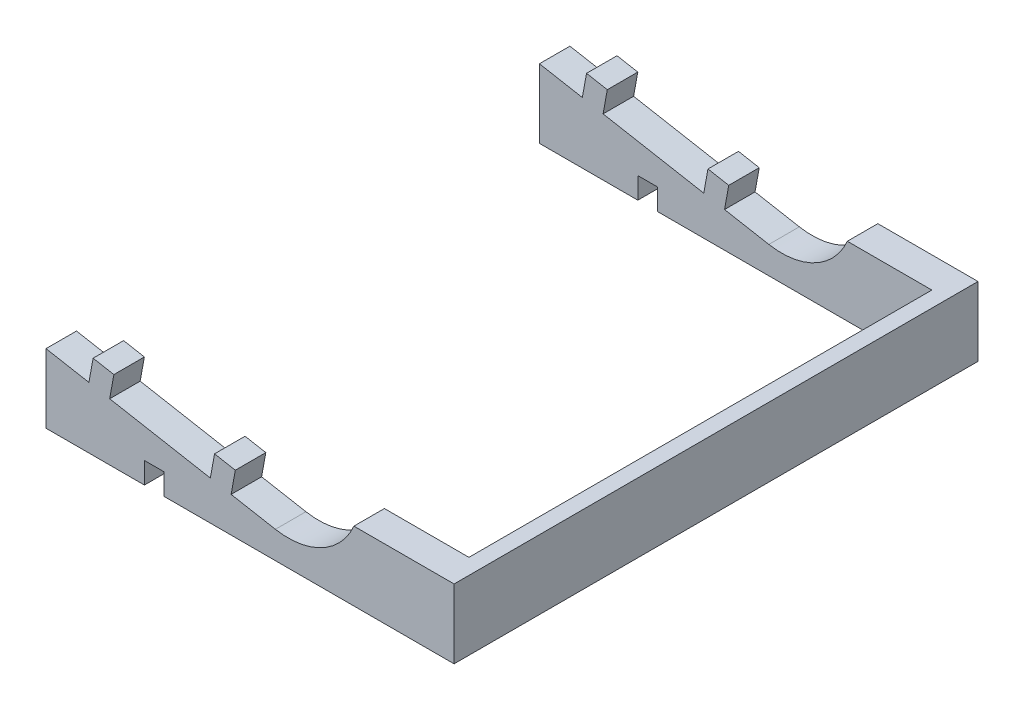
ISO-10303-21;
HEADER;
FILE_DESCRIPTION(('STEP AP214'),'2;1');
FILE_NAME('part.step','',(''),(''),'','','');
FILE_SCHEMA(('AUTOMOTIVE_DESIGN { 1 0 10303 214 1 1 1 1 }'));
ENDSEC;
DATA;
#1=APPLICATION_CONTEXT('core data for automotive mechanical design processes');
#2=APPLICATION_PROTOCOL_DEFINITION('international standard','automotive_design',2000,#1);
#3=PRODUCT_CONTEXT('',#1,'mechanical');
#4=PRODUCT('Part','Part','',(#3));
#5=PRODUCT_RELATED_PRODUCT_CATEGORY('part','',(#4));
#6=PRODUCT_DEFINITION_FORMATION('','',#4);
#7=PRODUCT_DEFINITION_CONTEXT('part definition',#1,'design');
#8=PRODUCT_DEFINITION('design','',#6,#7);
#9=PRODUCT_DEFINITION_SHAPE('','',#8);
#10=(LENGTH_UNIT() NAMED_UNIT(*) SI_UNIT(.MILLI.,.METRE.));
#11=(NAMED_UNIT(*) PLANE_ANGLE_UNIT() SI_UNIT($,.RADIAN.));
#12=(NAMED_UNIT(*) SI_UNIT($,.STERADIAN.) SOLID_ANGLE_UNIT());
#13=UNCERTAINTY_MEASURE_WITH_UNIT(LENGTH_MEASURE(1.E-05),#10,'distance_accuracy_value','');
#14=(GEOMETRIC_REPRESENTATION_CONTEXT(3) GLOBAL_UNCERTAINTY_ASSIGNED_CONTEXT((#13)) GLOBAL_UNIT_ASSIGNED_CONTEXT((#10,
#11,#12)) REPRESENTATION_CONTEXT('',''));
#15=CARTESIAN_POINT('',(0.,0.,0.));
#16=DIRECTION('',(0.,0.,1.));
#17=DIRECTION('',(1.,0.,0.));
#18=AXIS2_PLACEMENT_3D('',#15,#16,#17);
#19=CARTESIAN_POINT('',(-43.0861734096094,0.15,120.286315816493));
#20=DIRECTION('',(0.,1.,0.));
#21=DIRECTION('',(0.,0.,1.));
#22=AXIS2_PLACEMENT_3D('',#19,#20,#21);
#23=PLANE('',#22);
#24=DIRECTION('',(1.,0.,0.));
#25=VECTOR('',#24,1.);
#26=CARTESIAN_POINT('',(-43.0861734096094,0.15,66.9999999999999));
#27=LINE('',#26,#25);
#28=CARTESIAN_POINT('',(-27.9999999999998,0.150000000000011,66.9999999999999));
#29=VERTEX_POINT('',#28);
#30=CARTESIAN_POINT('',(9.09999999999998,0.15,66.9999999999999));
#31=VERTEX_POINT('',#30);
#32=EDGE_CURVE('E482',#29,#31,#27,.T.);
#33=ORIENTED_EDGE('',*,*,#32,.F.);
#34=DIRECTION('',(0.,0.,-1.));
#35=VECTOR('',#34,1.);
#36=CARTESIAN_POINT('',(-27.9999999999998,0.15,120.286315816493));
#37=LINE('',#36,#35);
#38=CARTESIAN_POINT('',(-27.9999999999998,0.15,63.1));
#39=VERTEX_POINT('',#38);
#40=EDGE_CURVE('E334',#29,#39,#37,.T.);
#41=ORIENTED_EDGE('',*,*,#40,.T.);
#42=DIRECTION('',(-1.,0.,0.));
#43=VECTOR('',#42,1.);
#44=CARTESIAN_POINT('',(70.8888289970523,0.15,63.1));
#45=LINE('',#44,#43);
#46=CARTESIAN_POINT('',(7.09999999999998,0.15,63.1));
#47=VERTEX_POINT('',#46);
#48=EDGE_CURVE('E339',#47,#39,#45,.T.);
#49=ORIENTED_EDGE('',*,*,#48,.F.);
#50=DIRECTION('',(0.,0.,-1.));
#51=VECTOR('',#50,1.);
#52=CARTESIAN_POINT('',(7.09999999999998,0.15,0.));
#53=LINE('',#52,#51);
#54=CARTESIAN_POINT('',(7.09999999999998,0.15,3.89999999999991));
#55=VERTEX_POINT('',#54);
#56=EDGE_CURVE('E338',#47,#55,#53,.T.);
#57=ORIENTED_EDGE('',*,*,#56,.T.);
#58=DIRECTION('',(-1.,0.,0.));
#59=VECTOR('',#58,1.);
#60=CARTESIAN_POINT('',(70.8888289970523,0.15,3.89999999999991));
#61=LINE('',#60,#59);
#62=CARTESIAN_POINT('',(-27.9999999999998,0.15,3.89999999999991));
#63=VERTEX_POINT('',#62);
#64=EDGE_CURVE('E356',#55,#63,#61,.T.);
#65=ORIENTED_EDGE('',*,*,#64,.T.);
#66=CARTESIAN_POINT('',(-27.9999999999998,0.149999999999999,0.));
#67=VERTEX_POINT('',#66);
#68=EDGE_CURVE('E330',#63,#67,#37,.T.);
#69=ORIENTED_EDGE('',*,*,#68,.T.);
#70=DIRECTION('',(1.,0.,0.));
#71=VECTOR('',#70,1.);
#72=CARTESIAN_POINT('',(-43.0861734096094,0.15,0.));
#73=LINE('',#72,#71);
#74=CARTESIAN_POINT('',(9.09999999999998,0.15,0.));
#75=VERTEX_POINT('',#74);
#76=EDGE_CURVE('E421',#67,#75,#73,.T.);
#77=ORIENTED_EDGE('',*,*,#76,.T.);
#78=DIRECTION('',(0.,0.,-1.));
#79=VECTOR('',#78,1.);
#80=CARTESIAN_POINT('',(9.09999999999998,0.15,120.286315816493));
#81=LINE('',#80,#79);
#82=EDGE_CURVE('E417',#31,#75,#81,.T.);
#83=ORIENTED_EDGE('',*,*,#82,.F.);
#84=EDGE_LOOP('',(#33,#41,#49,#57,#65,#69,#77,#83));
#85=FACE_BOUND('',#84,.T.);
#86=ADVANCED_FACE('F59',(#85),#23,.F.);
#87=CARTESIAN_POINT('',(-43.0861734096094,0.15,0.));
#88=VERTEX_POINT('',#87);
#89=CARTESIAN_POINT('',(-30.5000000000001,0.149999999999999,0.));
#90=VERTEX_POINT('',#89);
#91=EDGE_CURVE('E418',#88,#90,#73,.T.);
#92=ORIENTED_EDGE('',*,*,#91,.T.);
#93=DIRECTION('',(0.,0.,1.));
#94=VECTOR('',#93,1.);
#95=CARTESIAN_POINT('',(-30.5000000000001,0.15,120.286315816493));
#96=LINE('',#95,#94);
#97=CARTESIAN_POINT('',(-30.5000000000001,0.15,3.89999999999991));
#98=VERTEX_POINT('',#97);
#99=EDGE_CURVE('E323',#90,#98,#96,.T.);
#100=ORIENTED_EDGE('',*,*,#99,.T.);
#101=CARTESIAN_POINT('',(-43.0861734096094,0.15,3.89999999999991));
#102=VERTEX_POINT('',#101);
#103=EDGE_CURVE('E352',#98,#102,#61,.T.);
#104=ORIENTED_EDGE('',*,*,#103,.T.);
#105=DIRECTION('',(0.,0.,-1.));
#106=VECTOR('',#105,1.);
#107=CARTESIAN_POINT('',(-43.0861734096094,0.15,120.286315816493));
#108=LINE('',#107,#106);
#109=EDGE_CURVE('E425',#102,#88,#108,.T.);
#110=ORIENTED_EDGE('',*,*,#109,.T.);
#111=EDGE_LOOP('',(#92,#100,#104,#110));
#112=FACE_BOUND('',#111,.T.);
#113=ADVANCED_FACE('F640',(#112),#23,.F.);
#114=CARTESIAN_POINT('',(-12.1094093652468,12.6310365174259,120.286315816493));
#115=DIRECTION('',(0.,0.,-1.));
#116=DIRECTION('',(-1.,0.,0.));
#117=AXIS2_PLACEMENT_3D('',#114,#115,#116);
#118=CYLINDRICAL_SURFACE('',#117,9.15);
#119=CARTESIAN_POINT('',(-12.1094093652468,12.6310365174259,63.1));
#120=DIRECTION('',(0.,0.,-1.));
#121=DIRECTION('',(-1.,0.,0.));
#122=AXIS2_PLACEMENT_3D('',#119,#120,#121);
#123=CIRCLE('',#122,9.15);
#124=CARTESIAN_POINT('',(-13.7480135565789,3.62895474129495,63.1));
#125=VERTEX_POINT('',#124);
#126=CARTESIAN_POINT('',(-3.71114587203296,8.99900261084514,63.1));
#127=VERTEX_POINT('',#126);
#128=EDGE_CURVE('E388',#125,#127,#123,.F.);
#129=ORIENTED_EDGE('',*,*,#128,.F.);
#130=DIRECTION('',(0.,0.,-1.));
#131=VECTOR('',#130,1.);
#132=CARTESIAN_POINT('',(-13.7480135565789,3.62895474129495,120.286315816493));
#133=LINE('',#132,#131);
#134=CARTESIAN_POINT('',(-13.7480135565789,3.62895474129495,66.9999999999999));
#135=VERTEX_POINT('',#134);
#136=EDGE_CURVE('E471',#135,#125,#133,.T.);
#137=ORIENTED_EDGE('',*,*,#136,.F.);
#138=CARTESIAN_POINT('',(-12.1094093652468,12.6310365174259,66.9999999999999));
#139=DIRECTION('',(0.,0.,1.));
#140=DIRECTION('',(1.,0.,0.));
#141=AXIS2_PLACEMENT_3D('',#138,#139,#140);
#142=CIRCLE('',#141,9.15);
#143=CARTESIAN_POINT('',(-3.71114587203296,8.99900261084514,66.9999999999999));
#144=VERTEX_POINT('',#143);
#145=EDGE_CURVE('E512',#144,#135,#142,.F.);
#146=ORIENTED_EDGE('',*,*,#145,.F.);
#147=DIRECTION('',(0.,0.,-1.));
#148=VECTOR('',#147,1.);
#149=CARTESIAN_POINT('',(-3.71114587203296,8.99900261084514,120.286315816493));
#150=LINE('',#149,#148);
#151=EDGE_CURVE('E476',#144,#127,#150,.T.);
#152=ORIENTED_EDGE('',*,*,#151,.T.);
#153=EDGE_LOOP('',(#129,#137,#146,#152));
#154=FACE_BOUND('',#153,.T.);
#155=ADVANCED_FACE('F659',(#154),#118,.F.);
#156=CARTESIAN_POINT('',(-13.7480135565789,3.62895474129495,120.286315816493));
#157=DIRECTION('',(-0.179082425282203,-0.983834073894091,0.));
#158=DIRECTION('',(0.983834073894091,-0.179082425282203,0.));
#159=AXIS2_PLACEMENT_3D('',#156,#157,#158);
#160=PLANE('',#159);
#161=DIRECTION('',(0.983834073894091,-0.179082425282203,0.));
#162=VECTOR('',#161,1.);
#163=CARTESIAN_POINT('',(-13.7480135565789,3.62895474129495,63.1));
#164=LINE('',#163,#162);
#165=CARTESIAN_POINT('',(-19.4130541290162,4.6601339126146,63.1));
#166=VERTEX_POINT('',#165);
#167=EDGE_CURVE('E390',#166,#125,#164,.T.);
#168=ORIENTED_EDGE('',*,*,#167,.F.);
#169=DIRECTION('',(0.,0.,-1.));
#170=VECTOR('',#169,1.);
#171=CARTESIAN_POINT('',(-19.4130541290162,4.6601339126146,120.286315816493));
#172=LINE('',#171,#170);
#173=CARTESIAN_POINT('',(-19.4130541290162,4.6601339126146,66.9999999999999));
#174=VERTEX_POINT('',#173);
#175=EDGE_CURVE('E466',#174,#166,#172,.T.);
#176=ORIENTED_EDGE('',*,*,#175,.F.);
#177=DIRECTION('',(-0.983834073894091,0.179082425282203,0.));
#178=VECTOR('',#177,1.);
#179=CARTESIAN_POINT('',(-13.7480135565789,3.62895474129495,66.9999999999999));
#180=LINE('',#179,#178);
#181=EDGE_CURVE('E509',#135,#174,#180,.T.);
#182=ORIENTED_EDGE('',*,*,#181,.F.);
#183=ORIENTED_EDGE('',*,*,#136,.T.);
#184=EDGE_LOOP('',(#168,#176,#182,#183));
#185=FACE_BOUND('',#184,.T.);
#186=ADVANCED_FACE('F708',(#185),#160,.F.);
#187=CARTESIAN_POINT('',(-18.8758068531696,7.61163613429687,120.286315816493));
#188=DIRECTION('',(-0.983834073894091,0.179082425282202,0.));
#189=DIRECTION('',(-0.179082425282202,-0.983834073894091,0.));
#190=AXIS2_PLACEMENT_3D('',#187,#188,#189);
#191=PLANE('',#190);
#192=DIRECTION('',(-0.179082425282202,-0.983834073894091,0.));
#193=VECTOR('',#192,1.);
#194=CARTESIAN_POINT('',(-18.8758068531696,7.61163613429687,63.1));
#195=LINE('',#194,#193);
#196=CARTESIAN_POINT('',(-18.8758068531696,7.61163613429687,63.1));
#197=VERTEX_POINT('',#196);
#198=EDGE_CURVE('E392',#197,#166,#195,.T.);
#199=ORIENTED_EDGE('',*,*,#198,.F.);
#200=DIRECTION('',(0.,0.,-1.));
#201=VECTOR('',#200,1.);
#202=CARTESIAN_POINT('',(-18.8758068531696,7.61163613429687,120.286315816493));
#203=LINE('',#202,#201);
#204=CARTESIAN_POINT('',(-18.8758068531696,7.61163613429687,66.9999999999999));
#205=VERTEX_POINT('',#204);
#206=EDGE_CURVE('E461',#205,#197,#203,.T.);
#207=ORIENTED_EDGE('',*,*,#206,.F.);
#208=DIRECTION('',(0.179082425282202,0.983834073894091,0.));
#209=VECTOR('',#208,1.);
#210=CARTESIAN_POINT('',(-18.8758068531696,7.61163613429687,66.9999999999999));
#211=LINE('',#210,#209);
#212=EDGE_CURVE('E506',#174,#205,#211,.T.);
#213=ORIENTED_EDGE('',*,*,#212,.F.);
#214=ORIENTED_EDGE('',*,*,#175,.T.);
#215=EDGE_LOOP('',(#199,#207,#213,#214));
#216=FACE_BOUND('',#215,.T.);
#217=ADVANCED_FACE('F705',(#216),#191,.F.);
#218=CARTESIAN_POINT('',(-21.5321588526836,8.09515868255882,120.286315816493));
#219=DIRECTION('',(-0.179082425282203,-0.983834073894091,0.));
#220=DIRECTION('',(0.983834073894091,-0.179082425282203,0.));
#221=AXIS2_PLACEMENT_3D('',#218,#219,#220);
#222=PLANE('',#221);
#223=DIRECTION('',(0.983834073894091,-0.179082425282203,0.));
#224=VECTOR('',#223,1.);
#225=CARTESIAN_POINT('',(-21.5321588526836,8.09515868255882,63.1));
#226=LINE('',#225,#224);
#227=CARTESIAN_POINT('',(-21.5321588526836,8.09515868255882,63.1));
#228=VERTEX_POINT('',#227);
#229=EDGE_CURVE('E394',#228,#197,#226,.T.);
#230=ORIENTED_EDGE('',*,*,#229,.F.);
#231=DIRECTION('',(0.,0.,-1.));
#232=VECTOR('',#231,1.);
#233=CARTESIAN_POINT('',(-21.5321588526836,8.09515868255882,120.286315816493));
#234=LINE('',#233,#232);
#235=CARTESIAN_POINT('',(-21.5321588526836,8.09515868255882,66.9999999999999));
#236=VERTEX_POINT('',#235);
#237=EDGE_CURVE('E456',#236,#228,#234,.T.);
#238=ORIENTED_EDGE('',*,*,#237,.F.);
#239=DIRECTION('',(-0.983834073894091,0.179082425282203,0.));
#240=VECTOR('',#239,1.);
#241=CARTESIAN_POINT('',(-21.5321588526836,8.09515868255882,66.9999999999999));
#242=LINE('',#241,#240);
#243=EDGE_CURVE('E503',#205,#236,#242,.T.);
#244=ORIENTED_EDGE('',*,*,#243,.F.);
#245=ORIENTED_EDGE('',*,*,#206,.T.);
#246=EDGE_LOOP('',(#230,#238,#244,#245));
#247=FACE_BOUND('',#246,.T.);
#248=ADVANCED_FACE('F700',(#247),#222,.F.);
#249=CARTESIAN_POINT('',(-22.0694061285303,5.14365646087654,120.286315816493));
#250=DIRECTION('',(0.983834073894091,-0.179082425282203,0.));
#251=DIRECTION('',(0.179082425282203,0.983834073894091,0.));
#252=AXIS2_PLACEMENT_3D('',#249,#250,#251);
#253=PLANE('',#252);
#254=DIRECTION('',(0.179082425282203,0.983834073894091,0.));
#255=VECTOR('',#254,1.);
#256=CARTESIAN_POINT('',(-22.0694061285303,5.14365646087654,63.1));
#257=LINE('',#256,#255);
#258=CARTESIAN_POINT('',(-22.0694061285303,5.14365646087654,63.1));
#259=VERTEX_POINT('',#258);
#260=EDGE_CURVE('E396',#259,#228,#257,.T.);
#261=ORIENTED_EDGE('',*,*,#260,.F.);
#262=DIRECTION('',(0.,0.,-1.));
#263=VECTOR('',#262,1.);
#264=CARTESIAN_POINT('',(-22.0694061285303,5.14365646087654,120.286315816493));
#265=LINE('',#264,#263);
#266=CARTESIAN_POINT('',(-22.0694061285303,5.14365646087654,66.9999999999999));
#267=VERTEX_POINT('',#266);
#268=EDGE_CURVE('E451',#267,#259,#265,.T.);
#269=ORIENTED_EDGE('',*,*,#268,.F.);
#270=DIRECTION('',(-0.179082425282203,-0.983834073894091,0.));
#271=VECTOR('',#270,1.);
#272=CARTESIAN_POINT('',(-22.0694061285303,5.14365646087654,66.9999999999999));
#273=LINE('',#272,#271);
#274=EDGE_CURVE('E500',#236,#267,#273,.T.);
#275=ORIENTED_EDGE('',*,*,#274,.F.);
#276=ORIENTED_EDGE('',*,*,#237,.T.);
#277=EDGE_LOOP('',(#261,#269,#275,#276));
#278=FACE_BOUND('',#277,.T.);
#279=ADVANCED_FACE('F697',(#278),#253,.F.);
#280=CARTESIAN_POINT('',(-22.0694061285303,5.14365646087654,120.286315816493));
#281=DIRECTION('',(-0.179082425282203,-0.983834073894091,0.));
#282=DIRECTION('',(0.983834073894091,-0.179082425282203,0.));
#283=AXIS2_PLACEMENT_3D('',#280,#281,#282);
#284=PLANE('',#283);
#285=DIRECTION('',(0.983834073894091,-0.179082425282203,0.));
#286=VECTOR('',#285,1.);
#287=CARTESIAN_POINT('',(-22.0694061285303,5.14365646087654,63.1));
#288=LINE('',#287,#286);
#289=CARTESIAN_POINT('',(-34.9427010242619,7.48691833040678,63.1));
#290=VERTEX_POINT('',#289);
#291=EDGE_CURVE('E398',#290,#259,#288,.T.);
#292=ORIENTED_EDGE('',*,*,#291,.F.);
#293=DIRECTION('',(0.,0.,-1.));
#294=VECTOR('',#293,1.);
#295=CARTESIAN_POINT('',(-34.9427010242619,7.48691833040678,120.286315816493));
#296=LINE('',#295,#294);
#297=CARTESIAN_POINT('',(-34.9427010242619,7.48691833040678,66.9999999999999));
#298=VERTEX_POINT('',#297);
#299=EDGE_CURVE('E446',#298,#290,#296,.T.);
#300=ORIENTED_EDGE('',*,*,#299,.F.);
#301=DIRECTION('',(-0.983834073894091,0.179082425282203,0.));
#302=VECTOR('',#301,1.);
#303=CARTESIAN_POINT('',(-22.0694061285303,5.14365646087654,66.9999999999999));
#304=LINE('',#303,#302);
#305=EDGE_CURVE('E497',#267,#298,#304,.T.);
#306=ORIENTED_EDGE('',*,*,#305,.F.);
#307=ORIENTED_EDGE('',*,*,#268,.T.);
#308=EDGE_LOOP('',(#292,#300,#306,#307));
#309=FACE_BOUND('',#308,.T.);
#310=ADVANCED_FACE('F692',(#309),#284,.F.);
#311=CARTESIAN_POINT('',(-34.4054537484152,10.4384205520891,120.286315816493));
#312=DIRECTION('',(-0.983834073894091,0.179082425282204,0.));
#313=DIRECTION('',(-0.179082425282204,-0.983834073894091,0.));
#314=AXIS2_PLACEMENT_3D('',#311,#312,#313);
#315=PLANE('',#314);
#316=DIRECTION('',(-0.179082425282204,-0.983834073894091,0.));
#317=VECTOR('',#316,1.);
#318=CARTESIAN_POINT('',(-34.4054537484152,10.4384205520891,63.1));
#319=LINE('',#318,#317);
#320=CARTESIAN_POINT('',(-34.4054537484152,10.4384205520891,63.1));
#321=VERTEX_POINT('',#320);
#322=EDGE_CURVE('E400',#321,#290,#319,.T.);
#323=ORIENTED_EDGE('',*,*,#322,.F.);
#324=DIRECTION('',(0.,0.,-1.));
#325=VECTOR('',#324,1.);
#326=CARTESIAN_POINT('',(-34.4054537484152,10.4384205520891,120.286315816493));
#327=LINE('',#326,#325);
#328=CARTESIAN_POINT('',(-34.4054537484152,10.4384205520891,66.9999999999999));
#329=VERTEX_POINT('',#328);
#330=EDGE_CURVE('E441',#329,#321,#327,.T.);
#331=ORIENTED_EDGE('',*,*,#330,.F.);
#332=DIRECTION('',(0.179082425282204,0.983834073894091,0.));
#333=VECTOR('',#332,1.);
#334=CARTESIAN_POINT('',(-34.4054537484152,10.4384205520891,66.9999999999999));
#335=LINE('',#334,#333);
#336=EDGE_CURVE('E494',#298,#329,#335,.T.);
#337=ORIENTED_EDGE('',*,*,#336,.F.);
#338=ORIENTED_EDGE('',*,*,#299,.T.);
#339=EDGE_LOOP('',(#323,#331,#337,#338));
#340=FACE_BOUND('',#339,.T.);
#341=ADVANCED_FACE('F689',(#340),#315,.F.);
#342=CARTESIAN_POINT('',(-37.0618057479293,10.921943100351,120.286315816493));
#343=DIRECTION('',(-0.179082425282202,-0.983834073894091,0.));
#344=DIRECTION('',(0.983834073894091,-0.179082425282202,0.));
#345=AXIS2_PLACEMENT_3D('',#342,#343,#344);
#346=PLANE('',#345);
#347=DIRECTION('',(0.983834073894091,-0.179082425282202,0.));
#348=VECTOR('',#347,1.);
#349=CARTESIAN_POINT('',(-37.0618057479293,10.921943100351,63.1));
#350=LINE('',#349,#348);
#351=CARTESIAN_POINT('',(-37.0618057479293,10.921943100351,63.1));
#352=VERTEX_POINT('',#351);
#353=EDGE_CURVE('E402',#352,#321,#350,.T.);
#354=ORIENTED_EDGE('',*,*,#353,.F.);
#355=DIRECTION('',(0.,0.,-1.));
#356=VECTOR('',#355,1.);
#357=CARTESIAN_POINT('',(-37.0618057479293,10.921943100351,120.286315816493));
#358=LINE('',#357,#356);
#359=CARTESIAN_POINT('',(-37.0618057479293,10.921943100351,66.9999999999999));
#360=VERTEX_POINT('',#359);
#361=EDGE_CURVE('E436',#360,#352,#358,.T.);
#362=ORIENTED_EDGE('',*,*,#361,.F.);
#363=DIRECTION('',(-0.983834073894091,0.179082425282202,0.));
#364=VECTOR('',#363,1.);
#365=CARTESIAN_POINT('',(-37.0618057479293,10.921943100351,66.9999999999999));
#366=LINE('',#365,#364);
#367=EDGE_CURVE('E491',#329,#360,#366,.T.);
#368=ORIENTED_EDGE('',*,*,#367,.F.);
#369=ORIENTED_EDGE('',*,*,#330,.T.);
#370=EDGE_LOOP('',(#354,#362,#368,#369));
#371=FACE_BOUND('',#370,.T.);
#372=ADVANCED_FACE('F684',(#371),#346,.F.);
#373=CARTESIAN_POINT('',(-37.5990530237759,7.97044087866873,120.286315816493));
#374=DIRECTION('',(0.983834073894091,-0.179082425282202,0.));
#375=DIRECTION('',(0.179082425282202,0.983834073894091,0.));
#376=AXIS2_PLACEMENT_3D('',#373,#374,#375);
#377=PLANE('',#376);
#378=DIRECTION('',(0.179082425282202,0.983834073894091,0.));
#379=VECTOR('',#378,1.);
#380=CARTESIAN_POINT('',(-37.5990530237759,7.97044087866873,63.1));
#381=LINE('',#380,#379);
#382=CARTESIAN_POINT('',(-37.5990530237759,7.97044087866873,63.1));
#383=VERTEX_POINT('',#382);
#384=EDGE_CURVE('E404',#383,#352,#381,.T.);
#385=ORIENTED_EDGE('',*,*,#384,.F.);
#386=DIRECTION('',(0.,0.,-1.));
#387=VECTOR('',#386,1.);
#388=CARTESIAN_POINT('',(-37.5990530237759,7.97044087866873,120.286315816493));
#389=LINE('',#388,#387);
#390=CARTESIAN_POINT('',(-37.5990530237759,7.97044087866873,66.9999999999999));
#391=VERTEX_POINT('',#390);
#392=EDGE_CURVE('E431',#391,#383,#389,.T.);
#393=ORIENTED_EDGE('',*,*,#392,.F.);
#394=DIRECTION('',(-0.179082425282202,-0.983834073894091,0.));
#395=VECTOR('',#394,1.);
#396=CARTESIAN_POINT('',(-37.5990530237759,7.97044087866873,66.9999999999999));
#397=LINE('',#396,#395);
#398=EDGE_CURVE('E488',#360,#391,#397,.T.);
#399=ORIENTED_EDGE('',*,*,#398,.F.);
#400=ORIENTED_EDGE('',*,*,#361,.T.);
#401=EDGE_LOOP('',(#385,#393,#399,#400));
#402=FACE_BOUND('',#401,.T.);
#403=ADVANCED_FACE('F681',(#402),#377,.F.);
#404=CARTESIAN_POINT('',(-37.5990530237759,7.97044087866873,120.286315816493));
#405=DIRECTION('',(-0.179082425282202,-0.983834073894091,0.));
#406=DIRECTION('',(0.983834073894091,-0.179082425282202,0.));
#407=AXIS2_PLACEMENT_3D('',#404,#405,#406);
#408=PLANE('',#407);
#409=DIRECTION('',(0.983834073894091,-0.179082425282202,0.));
#410=VECTOR('',#409,1.);
#411=CARTESIAN_POINT('',(-37.5990530237759,7.97044087866873,63.1));
#412=LINE('',#411,#410);
#413=CARTESIAN_POINT('',(-43.0861734096094,8.96923412296151,63.1));
#414=VERTEX_POINT('',#413);
#415=EDGE_CURVE('E406',#414,#383,#412,.T.);
#416=ORIENTED_EDGE('',*,*,#415,.F.);
#417=DIRECTION('',(0.,0.,-1.));
#418=VECTOR('',#417,1.);
#419=CARTESIAN_POINT('',(-43.0861734096094,8.96923412296151,120.286315816493));
#420=LINE('',#419,#418);
#421=CARTESIAN_POINT('',(-43.0861734096094,8.96923412296151,66.9999999999999));
#422=VERTEX_POINT('',#421);
#423=EDGE_CURVE('E426',#422,#414,#420,.T.);
#424=ORIENTED_EDGE('',*,*,#423,.F.);
#425=DIRECTION('',(-0.983834073894091,0.179082425282202,0.));
#426=VECTOR('',#425,1.);
#427=CARTESIAN_POINT('',(-37.5990530237759,7.97044087866873,66.9999999999999));
#428=LINE('',#427,#426);
#429=EDGE_CURVE('E485',#391,#422,#428,.T.);
#430=ORIENTED_EDGE('',*,*,#429,.F.);
#431=ORIENTED_EDGE('',*,*,#392,.T.);
#432=EDGE_LOOP('',(#416,#424,#430,#431));
#433=FACE_BOUND('',#432,.T.);
#434=ADVANCED_FACE('F670',(#433),#408,.F.);
#435=CARTESIAN_POINT('',(-43.0861734096094,8.96923412296151,120.286315816493));
#436=DIRECTION('',(1.,0.,0.));
#437=DIRECTION('',(0.,0.,-1.));
#438=AXIS2_PLACEMENT_3D('',#435,#436,#437);
#439=PLANE('',#438);
#440=DIRECTION('',(0.,-1.,0.));
#441=VECTOR('',#440,1.);
#442=CARTESIAN_POINT('',(-43.0861734096094,0.,63.1));
#443=LINE('',#442,#441);
#444=CARTESIAN_POINT('',(-43.0861734096094,0.15,63.1));
#445=VERTEX_POINT('',#444);
#446=EDGE_CURVE('E346',#414,#445,#443,.T.);
#447=ORIENTED_EDGE('',*,*,#446,.T.);
#448=CARTESIAN_POINT('',(-43.0861734096094,0.15,66.9999999999999));
#449=VERTEX_POINT('',#448);
#450=EDGE_CURVE('E537',#449,#445,#108,.T.);
#451=ORIENTED_EDGE('',*,*,#450,.F.);
#452=DIRECTION('',(0.,-1.,0.));
#453=VECTOR('',#452,1.);
#454=CARTESIAN_POINT('',(-43.0861734096094,8.96923412296151,66.9999999999999));
#455=LINE('',#454,#453);
#456=EDGE_CURVE('E483',#422,#449,#455,.T.);
#457=ORIENTED_EDGE('',*,*,#456,.F.);
#458=ORIENTED_EDGE('',*,*,#423,.T.);
#459=EDGE_LOOP('',(#447,#451,#457,#458));
#460=FACE_BOUND('',#459,.T.);
#461=ADVANCED_FACE('F663',(#460),#439,.F.);
#462=CARTESIAN_POINT('',(-30.5000000000001,0.15,63.1));
#463=VERTEX_POINT('',#462);
#464=EDGE_CURVE('E355',#463,#445,#45,.T.);
#465=ORIENTED_EDGE('',*,*,#464,.F.);
#466=CARTESIAN_POINT('',(-30.5000000000001,0.150000000000011,66.9999999999999));
#467=VERTEX_POINT('',#466);
#468=EDGE_CURVE('E74',#463,#467,#96,.T.);
#469=ORIENTED_EDGE('',*,*,#468,.T.);
#470=EDGE_CURVE('E311',#449,#467,#27,.T.);
#471=ORIENTED_EDGE('',*,*,#470,.F.);
#472=ORIENTED_EDGE('',*,*,#450,.T.);
#473=EDGE_LOOP('',(#465,#469,#471,#472));
#474=FACE_BOUND('',#473,.T.);
#475=ADVANCED_FACE('F655',(#474),#23,.F.);
#476=CARTESIAN_POINT('',(-3.71114587203296,8.99900261084514,120.286315816493));
#477=DIRECTION('',(0.,-1.,0.));
#478=DIRECTION('',(0.,0.,-1.));
#479=AXIS2_PLACEMENT_3D('',#476,#477,#478);
#480=PLANE('',#479);
#481=DIRECTION('',(1.,0.,0.));
#482=VECTOR('',#481,1.);
#483=CARTESIAN_POINT('',(-3.71114587203296,8.99900261084514,63.1));
#484=LINE('',#483,#482);
#485=CARTESIAN_POINT('',(7.09999999999998,8.99900261084514,63.1));
#486=VERTEX_POINT('',#485);
#487=EDGE_CURVE('E550',#127,#486,#484,.T.);
#488=ORIENTED_EDGE('',*,*,#487,.F.);
#489=ORIENTED_EDGE('',*,*,#151,.F.);
#490=DIRECTION('',(-1.,0.,0.));
#491=VECTOR('',#490,1.);
#492=CARTESIAN_POINT('',(-3.71114587203296,8.99900261084514,66.9999999999999));
#493=LINE('',#492,#491);
#494=CARTESIAN_POINT('',(9.09999999999998,8.99900261084514,66.9999999999999));
#495=VERTEX_POINT('',#494);
#496=EDGE_CURVE('E412',#495,#144,#493,.T.);
#497=ORIENTED_EDGE('',*,*,#496,.F.);
#498=DIRECTION('',(0.,0.,-1.));
#499=VECTOR('',#498,1.);
#500=CARTESIAN_POINT('',(9.09999999999998,8.99900261084514,120.286315816493));
#501=LINE('',#500,#499);
#502=CARTESIAN_POINT('',(9.09999999999998,8.99900261084514,0.));
#503=VERTEX_POINT('',#502);
#504=EDGE_CURVE('E413',#495,#503,#501,.T.);
#505=ORIENTED_EDGE('',*,*,#504,.T.);
#506=DIRECTION('',(-1.,0.,0.));
#507=VECTOR('',#506,1.);
#508=CARTESIAN_POINT('',(-3.71114587203296,8.99900261084514,0.));
#509=LINE('',#508,#507);
#510=CARTESIAN_POINT('',(-3.71114587203296,8.99900261084514,0.));
#511=VERTEX_POINT('',#510);
#512=EDGE_CURVE('E409',#503,#511,#509,.T.);
#513=ORIENTED_EDGE('',*,*,#512,.T.);
#514=CARTESIAN_POINT('',(-3.71114587203296,8.99900261084514,3.89999999999992));
#515=VERTEX_POINT('',#514);
#516=EDGE_CURVE('E408',#515,#511,#150,.T.);
#517=ORIENTED_EDGE('',*,*,#516,.F.);
#518=DIRECTION('',(1.,0.,0.));
#519=VECTOR('',#518,1.);
#520=CARTESIAN_POINT('',(-3.71114587203296,8.99900261084514,3.89999999999992));
#521=LINE('',#520,#519);
#522=CARTESIAN_POINT('',(7.09999999999998,8.99900261084514,3.89999999999992));
#523=VERTEX_POINT('',#522);
#524=EDGE_CURVE('E480',#515,#523,#521,.T.);
#525=ORIENTED_EDGE('',*,*,#524,.T.);
#526=DIRECTION('',(0.,0.,-1.));
#527=VECTOR('',#526,1.);
#528=CARTESIAN_POINT('',(7.09999999999998,8.99900261084514,120.286315816493));
#529=LINE('',#528,#527);
#530=EDGE_CURVE('E547',#486,#523,#529,.T.);
#531=ORIENTED_EDGE('',*,*,#530,.F.);
#532=EDGE_LOOP('',(#488,#489,#497,#505,#513,#517,#525,#531));
#533=FACE_BOUND('',#532,.T.);
#534=ADVANCED_FACE('F596',(#533),#480,.F.);
#535=CARTESIAN_POINT('',(-13.7480135565789,3.62895474129495,3.89999999999992));
#536=VERTEX_POINT('',#535);
#537=CARTESIAN_POINT('',(-13.7480135565789,3.62895474129495,0.));
#538=VERTEX_POINT('',#537);
#539=EDGE_CURVE('E475',#536,#538,#133,.T.);
#540=ORIENTED_EDGE('',*,*,#539,.F.);
#541=CARTESIAN_POINT('',(-12.1094093652468,12.6310365174259,3.89999999999992));
#542=DIRECTION('',(0.,0.,-1.));
#543=DIRECTION('',(0.,1.,0.));
#544=AXIS2_PLACEMENT_3D('',#541,#542,#543);
#545=CIRCLE('',#544,9.15);
#546=EDGE_CURVE('E345',#536,#515,#545,.F.);
#547=ORIENTED_EDGE('',*,*,#546,.T.);
#548=ORIENTED_EDGE('',*,*,#516,.T.);
#549=CARTESIAN_POINT('',(-12.1094093652468,12.6310365174259,0.));
#550=DIRECTION('',(0.,0.,-1.));
#551=DIRECTION('',(1.,0.,0.));
#552=AXIS2_PLACEMENT_3D('',#549,#550,#551);
#553=CIRCLE('',#552,9.15);
#554=EDGE_CURVE('E472',#511,#538,#553,.T.);
#555=ORIENTED_EDGE('',*,*,#554,.T.);
#556=EDGE_LOOP('',(#540,#547,#548,#555));
#557=FACE_BOUND('',#556,.T.);
#558=ADVANCED_FACE('F594',(#557),#118,.F.);
#559=CARTESIAN_POINT('',(-19.4130541290162,4.6601339126146,3.89999999999992));
#560=VERTEX_POINT('',#559);
#561=CARTESIAN_POINT('',(-19.4130541290162,4.6601339126146,0.));
#562=VERTEX_POINT('',#561);
#563=EDGE_CURVE('E470',#560,#562,#172,.T.);
#564=ORIENTED_EDGE('',*,*,#563,.F.);
#565=DIRECTION('',(0.983834073894091,-0.179082425282203,0.));
#566=VECTOR('',#565,1.);
#567=CARTESIAN_POINT('',(-13.7480135565789,3.62895474129495,3.89999999999992));
#568=LINE('',#567,#566);
#569=EDGE_CURVE('E361',#560,#536,#568,.T.);
#570=ORIENTED_EDGE('',*,*,#569,.T.);
#571=ORIENTED_EDGE('',*,*,#539,.T.);
#572=DIRECTION('',(-0.983834073894091,0.179082425282203,0.));
#573=VECTOR('',#572,1.);
#574=CARTESIAN_POINT('',(-13.7480135565789,3.62895474129495,0.));
#575=LINE('',#574,#573);
#576=EDGE_CURVE('E467',#538,#562,#575,.T.);
#577=ORIENTED_EDGE('',*,*,#576,.T.);
#578=EDGE_LOOP('',(#564,#570,#571,#577));
#579=FACE_BOUND('',#578,.T.);
#580=ADVANCED_FACE('F602',(#579),#160,.F.);
#581=CARTESIAN_POINT('',(-18.8758068531696,7.61163613429687,3.89999999999992));
#582=VERTEX_POINT('',#581);
#583=CARTESIAN_POINT('',(-18.8758068531696,7.61163613429687,0.));
#584=VERTEX_POINT('',#583);
#585=EDGE_CURVE('E465',#582,#584,#203,.T.);
#586=ORIENTED_EDGE('',*,*,#585,.F.);
#587=DIRECTION('',(-0.179082425282202,-0.983834073894091,0.));
#588=VECTOR('',#587,1.);
#589=CARTESIAN_POINT('',(-18.8758068531696,7.61163613429688,3.89999999999992));
#590=LINE('',#589,#588);
#591=EDGE_CURVE('E364',#582,#560,#590,.T.);
#592=ORIENTED_EDGE('',*,*,#591,.T.);
#593=ORIENTED_EDGE('',*,*,#563,.T.);
#594=DIRECTION('',(0.179082425282202,0.983834073894091,0.));
#595=VECTOR('',#594,1.);
#596=CARTESIAN_POINT('',(-18.8758068531696,7.61163613429687,0.));
#597=LINE('',#596,#595);
#598=EDGE_CURVE('E462',#562,#584,#597,.T.);
#599=ORIENTED_EDGE('',*,*,#598,.T.);
#600=EDGE_LOOP('',(#586,#592,#593,#599));
#601=FACE_BOUND('',#600,.T.);
#602=ADVANCED_FACE('F605',(#601),#191,.F.);
#603=CARTESIAN_POINT('',(-21.5321588526836,8.09515868255882,3.89999999999992));
#604=VERTEX_POINT('',#603);
#605=CARTESIAN_POINT('',(-21.5321588526836,8.09515868255882,0.));
#606=VERTEX_POINT('',#605);
#607=EDGE_CURVE('E460',#604,#606,#234,.T.);
#608=ORIENTED_EDGE('',*,*,#607,.F.);
#609=DIRECTION('',(0.983834073894091,-0.179082425282203,0.));
#610=VECTOR('',#609,1.);
#611=CARTESIAN_POINT('',(-21.5321588526836,8.09515868255882,3.89999999999992));
#612=LINE('',#611,#610);
#613=EDGE_CURVE('E367',#604,#582,#612,.T.);
#614=ORIENTED_EDGE('',*,*,#613,.T.);
#615=ORIENTED_EDGE('',*,*,#585,.T.);
#616=DIRECTION('',(-0.983834073894091,0.179082425282203,0.));
#617=VECTOR('',#616,1.);
#618=CARTESIAN_POINT('',(-21.5321588526836,8.09515868255882,0.));
#619=LINE('',#618,#617);
#620=EDGE_CURVE('E457',#584,#606,#619,.T.);
#621=ORIENTED_EDGE('',*,*,#620,.T.);
#622=EDGE_LOOP('',(#608,#614,#615,#621));
#623=FACE_BOUND('',#622,.T.);
#624=ADVANCED_FACE('F608',(#623),#222,.F.);
#625=CARTESIAN_POINT('',(-22.0694061285303,5.14365646087654,3.89999999999992));
#626=VERTEX_POINT('',#625);
#627=CARTESIAN_POINT('',(-22.0694061285303,5.14365646087654,0.));
#628=VERTEX_POINT('',#627);
#629=EDGE_CURVE('E455',#626,#628,#265,.T.);
#630=ORIENTED_EDGE('',*,*,#629,.F.);
#631=DIRECTION('',(0.179082425282203,0.983834073894091,0.));
#632=VECTOR('',#631,1.);
#633=CARTESIAN_POINT('',(-22.0694061285303,5.14365646087655,3.89999999999992));
#634=LINE('',#633,#632);
#635=EDGE_CURVE('E370',#626,#604,#634,.T.);
#636=ORIENTED_EDGE('',*,*,#635,.T.);
#637=ORIENTED_EDGE('',*,*,#607,.T.);
#638=DIRECTION('',(-0.179082425282203,-0.983834073894091,0.));
#639=VECTOR('',#638,1.);
#640=CARTESIAN_POINT('',(-22.0694061285303,5.14365646087654,0.));
#641=LINE('',#640,#639);
#642=EDGE_CURVE('E452',#606,#628,#641,.T.);
#643=ORIENTED_EDGE('',*,*,#642,.T.);
#644=EDGE_LOOP('',(#630,#636,#637,#643));
#645=FACE_BOUND('',#644,.T.);
#646=ADVANCED_FACE('F612',(#645),#253,.F.);
#647=CARTESIAN_POINT('',(-34.9427010242619,7.48691833040678,3.89999999999992));
#648=VERTEX_POINT('',#647);
#649=CARTESIAN_POINT('',(-34.9427010242619,7.48691833040678,0.));
#650=VERTEX_POINT('',#649);
#651=EDGE_CURVE('E450',#648,#650,#296,.T.);
#652=ORIENTED_EDGE('',*,*,#651,.F.);
#653=DIRECTION('',(0.983834073894091,-0.179082425282203,0.));
#654=VECTOR('',#653,1.);
#655=CARTESIAN_POINT('',(-22.0694061285303,5.14365646087654,3.89999999999992));
#656=LINE('',#655,#654);
#657=EDGE_CURVE('E373',#648,#626,#656,.T.);
#658=ORIENTED_EDGE('',*,*,#657,.T.);
#659=ORIENTED_EDGE('',*,*,#629,.T.);
#660=DIRECTION('',(-0.983834073894091,0.179082425282203,0.));
#661=VECTOR('',#660,1.);
#662=CARTESIAN_POINT('',(-22.0694061285303,5.14365646087654,0.));
#663=LINE('',#662,#661);
#664=EDGE_CURVE('E447',#628,#650,#663,.T.);
#665=ORIENTED_EDGE('',*,*,#664,.T.);
#666=EDGE_LOOP('',(#652,#658,#659,#665));
#667=FACE_BOUND('',#666,.T.);
#668=ADVANCED_FACE('F616',(#667),#284,.F.);
#669=CARTESIAN_POINT('',(-34.4054537484152,10.4384205520891,3.89999999999992));
#670=VERTEX_POINT('',#669);
#671=CARTESIAN_POINT('',(-34.4054537484152,10.4384205520891,0.));
#672=VERTEX_POINT('',#671);
#673=EDGE_CURVE('E445',#670,#672,#327,.T.);
#674=ORIENTED_EDGE('',*,*,#673,.F.);
#675=DIRECTION('',(-0.179082425282204,-0.983834073894091,0.));
#676=VECTOR('',#675,1.);
#677=CARTESIAN_POINT('',(-34.4054537484152,10.4384205520891,3.89999999999992));
#678=LINE('',#677,#676);
#679=EDGE_CURVE('E376',#670,#648,#678,.T.);
#680=ORIENTED_EDGE('',*,*,#679,.T.);
#681=ORIENTED_EDGE('',*,*,#651,.T.);
#682=DIRECTION('',(0.179082425282204,0.983834073894091,0.));
#683=VECTOR('',#682,1.);
#684=CARTESIAN_POINT('',(-34.4054537484152,10.4384205520891,0.));
#685=LINE('',#684,#683);
#686=EDGE_CURVE('E442',#650,#672,#685,.T.);
#687=ORIENTED_EDGE('',*,*,#686,.T.);
#688=EDGE_LOOP('',(#674,#680,#681,#687));
#689=FACE_BOUND('',#688,.T.);
#690=ADVANCED_FACE('F620',(#689),#315,.F.);
#691=CARTESIAN_POINT('',(-37.0618057479293,10.921943100351,3.89999999999992));
#692=VERTEX_POINT('',#691);
#693=CARTESIAN_POINT('',(-37.0618057479293,10.921943100351,0.));
#694=VERTEX_POINT('',#693);
#695=EDGE_CURVE('E440',#692,#694,#358,.T.);
#696=ORIENTED_EDGE('',*,*,#695,.F.);
#697=DIRECTION('',(0.983834073894091,-0.179082425282202,0.));
#698=VECTOR('',#697,1.);
#699=CARTESIAN_POINT('',(-37.0618057479293,10.921943100351,3.89999999999992));
#700=LINE('',#699,#698);
#701=EDGE_CURVE('E379',#692,#670,#700,.T.);
#702=ORIENTED_EDGE('',*,*,#701,.T.);
#703=ORIENTED_EDGE('',*,*,#673,.T.);
#704=DIRECTION('',(-0.983834073894091,0.179082425282202,0.));
#705=VECTOR('',#704,1.);
#706=CARTESIAN_POINT('',(-37.0618057479293,10.921943100351,0.));
#707=LINE('',#706,#705);
#708=EDGE_CURVE('E437',#672,#694,#707,.T.);
#709=ORIENTED_EDGE('',*,*,#708,.T.);
#710=EDGE_LOOP('',(#696,#702,#703,#709));
#711=FACE_BOUND('',#710,.T.);
#712=ADVANCED_FACE('F624',(#711),#346,.F.);
#713=CARTESIAN_POINT('',(-37.5990530237759,7.97044087866873,3.89999999999992));
#714=VERTEX_POINT('',#713);
#715=CARTESIAN_POINT('',(-37.5990530237759,7.97044087866873,0.));
#716=VERTEX_POINT('',#715);
#717=EDGE_CURVE('E435',#714,#716,#389,.T.);
#718=ORIENTED_EDGE('',*,*,#717,.F.);
#719=DIRECTION('',(0.179082425282202,0.983834073894091,0.));
#720=VECTOR('',#719,1.);
#721=CARTESIAN_POINT('',(-37.5990530237759,7.97044087866873,3.89999999999992));
#722=LINE('',#721,#720);
#723=EDGE_CURVE('E382',#714,#692,#722,.T.);
#724=ORIENTED_EDGE('',*,*,#723,.T.);
#725=ORIENTED_EDGE('',*,*,#695,.T.);
#726=DIRECTION('',(-0.179082425282202,-0.983834073894091,0.));
#727=VECTOR('',#726,1.);
#728=CARTESIAN_POINT('',(-37.5990530237759,7.97044087866873,0.));
#729=LINE('',#728,#727);
#730=EDGE_CURVE('E432',#694,#716,#729,.T.);
#731=ORIENTED_EDGE('',*,*,#730,.T.);
#732=EDGE_LOOP('',(#718,#724,#725,#731));
#733=FACE_BOUND('',#732,.T.);
#734=ADVANCED_FACE('F628',(#733),#377,.F.);
#735=CARTESIAN_POINT('',(-43.0861734096094,8.96923412296151,3.89999999999991));
#736=VERTEX_POINT('',#735);
#737=CARTESIAN_POINT('',(-43.0861734096094,8.96923412296151,0.));
#738=VERTEX_POINT('',#737);
#739=EDGE_CURVE('E430',#736,#738,#420,.T.);
#740=ORIENTED_EDGE('',*,*,#739,.F.);
#741=DIRECTION('',(0.983834073894091,-0.179082425282202,0.));
#742=VECTOR('',#741,1.);
#743=CARTESIAN_POINT('',(-37.5990530237759,7.97044087866873,3.89999999999992));
#744=LINE('',#743,#742);
#745=EDGE_CURVE('E385',#736,#714,#744,.T.);
#746=ORIENTED_EDGE('',*,*,#745,.T.);
#747=ORIENTED_EDGE('',*,*,#717,.T.);
#748=DIRECTION('',(-0.983834073894091,0.179082425282202,0.));
#749=VECTOR('',#748,1.);
#750=CARTESIAN_POINT('',(-37.5990530237759,7.97044087866873,0.));
#751=LINE('',#750,#749);
#752=EDGE_CURVE('E427',#716,#738,#751,.T.);
#753=ORIENTED_EDGE('',*,*,#752,.T.);
#754=EDGE_LOOP('',(#740,#746,#747,#753));
#755=FACE_BOUND('',#754,.T.);
#756=ADVANCED_FACE('F632',(#755),#408,.F.);
#757=ORIENTED_EDGE('',*,*,#109,.F.);
#758=DIRECTION('',(0.,-1.,0.));
#759=VECTOR('',#758,1.);
#760=CARTESIAN_POINT('',(-43.0861734096094,0.,3.89999999999991));
#761=LINE('',#760,#759);
#762=EDGE_CURVE('E349',#736,#102,#761,.T.);
#763=ORIENTED_EDGE('',*,*,#762,.F.);
#764=ORIENTED_EDGE('',*,*,#739,.T.);
#765=DIRECTION('',(0.,-1.,0.));
#766=VECTOR('',#765,1.);
#767=CARTESIAN_POINT('',(-43.0861734096094,8.96923412296151,0.));
#768=LINE('',#767,#766);
#769=EDGE_CURVE('E422',#738,#88,#768,.T.);
#770=ORIENTED_EDGE('',*,*,#769,.T.);
#771=EDGE_LOOP('',(#757,#763,#764,#770));
#772=FACE_BOUND('',#771,.T.);
#773=ADVANCED_FACE('F637',(#772),#439,.F.);
#774=CARTESIAN_POINT('',(9.09999999999998,0.15,120.286315816493));
#775=DIRECTION('',(-1.,0.,0.));
#776=DIRECTION('',(0.,0.,1.));
#777=AXIS2_PLACEMENT_3D('',#774,#775,#776);
#778=PLANE('',#777);
#779=DIRECTION('',(0.,1.,0.));
#780=VECTOR('',#779,1.);
#781=CARTESIAN_POINT('',(9.09999999999998,0.15,66.9999999999999));
#782=LINE('',#781,#780);
#783=EDGE_CURVE('E477',#31,#495,#782,.T.);
#784=ORIENTED_EDGE('',*,*,#783,.F.);
#785=ORIENTED_EDGE('',*,*,#82,.T.);
#786=DIRECTION('',(0.,1.,0.));
#787=VECTOR('',#786,1.);
#788=CARTESIAN_POINT('',(9.09999999999998,0.15,0.));
#789=LINE('',#788,#787);
#790=EDGE_CURVE('E414',#75,#503,#789,.T.);
#791=ORIENTED_EDGE('',*,*,#790,.T.);
#792=ORIENTED_EDGE('',*,*,#504,.F.);
#793=EDGE_LOOP('',(#784,#785,#791,#792));
#794=FACE_BOUND('',#793,.T.);
#795=ADVANCED_FACE('F577',(#794),#778,.F.);
#796=CARTESIAN_POINT('',(-12.1094093652468,12.6310365174259,0.));
#797=DIRECTION('',(0.,0.,1.));
#798=DIRECTION('',(1.,0.,0.));
#799=AXIS2_PLACEMENT_3D('',#796,#797,#798);
#800=PLANE('',#799);
#801=ORIENTED_EDGE('',*,*,#76,.F.);
#802=DIRECTION('',(0.,-1.,0.));
#803=VECTOR('',#802,1.);
#804=CARTESIAN_POINT('',(-27.9999999999998,2.875,0.));
#805=LINE('',#804,#803);
#806=CARTESIAN_POINT('',(-27.9999999999998,2.875,0.));
#807=VERTEX_POINT('',#806);
#808=EDGE_CURVE('E317',#807,#67,#805,.T.);
#809=ORIENTED_EDGE('',*,*,#808,.F.);
#810=DIRECTION('',(1.,0.,0.));
#811=VECTOR('',#810,1.);
#812=CARTESIAN_POINT('',(-27.9999999999998,2.875,0.));
#813=LINE('',#812,#811);
#814=CARTESIAN_POINT('',(-30.5000000000001,2.875,0.));
#815=VERTEX_POINT('',#814);
#816=EDGE_CURVE('E314',#815,#807,#813,.T.);
#817=ORIENTED_EDGE('',*,*,#816,.F.);
#818=DIRECTION('',(0.,1.,0.));
#819=VECTOR('',#818,1.);
#820=CARTESIAN_POINT('',(-30.5000000000001,2.875,0.));
#821=LINE('',#820,#819);
#822=EDGE_CURVE('E319',#90,#815,#821,.T.);
#823=ORIENTED_EDGE('',*,*,#822,.F.);
#824=ORIENTED_EDGE('',*,*,#91,.F.);
#825=ORIENTED_EDGE('',*,*,#769,.F.);
#826=ORIENTED_EDGE('',*,*,#752,.F.);
#827=ORIENTED_EDGE('',*,*,#730,.F.);
#828=ORIENTED_EDGE('',*,*,#708,.F.);
#829=ORIENTED_EDGE('',*,*,#686,.F.);
#830=ORIENTED_EDGE('',*,*,#664,.F.);
#831=ORIENTED_EDGE('',*,*,#642,.F.);
#832=ORIENTED_EDGE('',*,*,#620,.F.);
#833=ORIENTED_EDGE('',*,*,#598,.F.);
#834=ORIENTED_EDGE('',*,*,#576,.F.);
#835=ORIENTED_EDGE('',*,*,#554,.F.);
#836=ORIENTED_EDGE('',*,*,#512,.F.);
#837=ORIENTED_EDGE('',*,*,#790,.F.);
#838=EDGE_LOOP('',(#801,#809,#817,#823,#824,#825,#826,#827,#828,#829,#830,#831,#832,#833,#834,
#835,#836,#837));
#839=FACE_BOUND('',#838,.T.);
#840=ADVANCED_FACE('F572',(#839),#800,.F.);
#841=CARTESIAN_POINT('',(9.24999999999999,196.167174164999,66.9999999999999));
#842=DIRECTION('',(0.,0.,1.));
#843=DIRECTION('',(-1.,0.,0.));
#844=AXIS2_PLACEMENT_3D('',#841,#842,#843);
#845=PLANE('',#844);
#846=DIRECTION('',(0.,-1.,0.));
#847=VECTOR('',#846,1.);
#848=CARTESIAN_POINT('',(-27.9999999999998,2.875,66.9999999999999));
#849=LINE('',#848,#847);
#850=CARTESIAN_POINT('',(-27.9999999999998,2.875,66.9999999999999));
#851=VERTEX_POINT('',#850);
#852=EDGE_CURVE('E312',#851,#29,#849,.T.);
#853=ORIENTED_EDGE('',*,*,#852,.T.);
#854=ORIENTED_EDGE('',*,*,#32,.T.);
#855=ORIENTED_EDGE('',*,*,#783,.T.);
#856=ORIENTED_EDGE('',*,*,#496,.T.);
#857=ORIENTED_EDGE('',*,*,#145,.T.);
#858=ORIENTED_EDGE('',*,*,#181,.T.);
#859=ORIENTED_EDGE('',*,*,#212,.T.);
#860=ORIENTED_EDGE('',*,*,#243,.T.);
#861=ORIENTED_EDGE('',*,*,#274,.T.);
#862=ORIENTED_EDGE('',*,*,#305,.T.);
#863=ORIENTED_EDGE('',*,*,#336,.T.);
#864=ORIENTED_EDGE('',*,*,#367,.T.);
#865=ORIENTED_EDGE('',*,*,#398,.T.);
#866=ORIENTED_EDGE('',*,*,#429,.T.);
#867=ORIENTED_EDGE('',*,*,#456,.T.);
#868=ORIENTED_EDGE('',*,*,#470,.T.);
#869=DIRECTION('',(0.,1.,0.));
#870=VECTOR('',#869,1.);
#871=CARTESIAN_POINT('',(-30.5000000000001,2.875,66.9999999999999));
#872=LINE('',#871,#870);
#873=CARTESIAN_POINT('',(-30.5000000000001,2.875,66.9999999999999));
#874=VERTEX_POINT('',#873);
#875=EDGE_CURVE('E294',#467,#874,#872,.T.);
#876=ORIENTED_EDGE('',*,*,#875,.T.);
#877=DIRECTION('',(1.,0.,0.));
#878=VECTOR('',#877,1.);
#879=CARTESIAN_POINT('',(-27.9999999999998,2.875,66.9999999999999));
#880=LINE('',#879,#878);
#881=EDGE_CURVE('E301',#874,#851,#880,.T.);
#882=ORIENTED_EDGE('',*,*,#881,.T.);
#883=EDGE_LOOP('',(#853,#854,#855,#856,#857,#858,#859,#860,#861,#862,#863,#864,#865,#866,#867,
#868,#876,#882));
#884=FACE_BOUND('',#883,.T.);
#885=ADVANCED_FACE('F61',(#884),#845,.T.);
#886=CARTESIAN_POINT('',(7.09999999999998,0.15,120.286315816493));
#887=DIRECTION('',(-1.,0.,0.));
#888=DIRECTION('',(0.,0.,1.));
#889=AXIS2_PLACEMENT_3D('',#886,#887,#888);
#890=PLANE('',#889);
#891=ORIENTED_EDGE('',*,*,#530,.T.);
#892=DIRECTION('',(0.,1.,0.));
#893=VECTOR('',#892,1.);
#894=CARTESIAN_POINT('',(7.09999999999998,0.,3.89999999999991));
#895=LINE('',#894,#893);
#896=EDGE_CURVE('E336',#55,#523,#895,.T.);
#897=ORIENTED_EDGE('',*,*,#896,.F.);
#898=ORIENTED_EDGE('',*,*,#56,.F.);
#899=DIRECTION('',(0.,1.,0.));
#900=VECTOR('',#899,1.);
#901=CARTESIAN_POINT('',(7.09999999999998,0.,63.1));
#902=LINE('',#901,#900);
#903=EDGE_CURVE('E342',#47,#486,#902,.T.);
#904=ORIENTED_EDGE('',*,*,#903,.T.);
#905=EDGE_LOOP('',(#891,#897,#898,#904));
#906=FACE_BOUND('',#905,.T.);
#907=ADVANCED_FACE('F588',(#906),#890,.T.);
#908=CARTESIAN_POINT('',(70.8888289970523,0.,63.1));
#909=DIRECTION('',(0.,0.,-1.));
#910=DIRECTION('',(-1.,0.,0.));
#911=AXIS2_PLACEMENT_3D('',#908,#909,#910);
#912=PLANE('',#911);
#913=DIRECTION('',(0.,-1.,0.));
#914=VECTOR('',#913,1.);
#915=CARTESIAN_POINT('',(-27.9999999999998,0.,63.1));
#916=LINE('',#915,#914);
#917=CARTESIAN_POINT('',(-27.9999999999998,2.875,63.1));
#918=VERTEX_POINT('',#917);
#919=EDGE_CURVE('E333',#918,#39,#916,.T.);
#920=ORIENTED_EDGE('',*,*,#919,.F.);
#921=DIRECTION('',(1.,0.,0.));
#922=VECTOR('',#921,1.);
#923=CARTESIAN_POINT('',(70.8888289970523,2.875,63.1));
#924=LINE('',#923,#922);
#925=CARTESIAN_POINT('',(-30.5000000000001,2.875,63.1));
#926=VERTEX_POINT('',#925);
#927=EDGE_CURVE('E328',#926,#918,#924,.T.);
#928=ORIENTED_EDGE('',*,*,#927,.F.);
#929=DIRECTION('',(0.,1.,0.));
#930=VECTOR('',#929,1.);
#931=CARTESIAN_POINT('',(-30.5000000000001,0.,63.1));
#932=LINE('',#931,#930);
#933=EDGE_CURVE('E295',#463,#926,#932,.T.);
#934=ORIENTED_EDGE('',*,*,#933,.F.);
#935=ORIENTED_EDGE('',*,*,#464,.T.);
#936=ORIENTED_EDGE('',*,*,#446,.F.);
#937=ORIENTED_EDGE('',*,*,#415,.T.);
#938=ORIENTED_EDGE('',*,*,#384,.T.);
#939=ORIENTED_EDGE('',*,*,#353,.T.);
#940=ORIENTED_EDGE('',*,*,#322,.T.);
#941=ORIENTED_EDGE('',*,*,#291,.T.);
#942=ORIENTED_EDGE('',*,*,#260,.T.);
#943=ORIENTED_EDGE('',*,*,#229,.T.);
#944=ORIENTED_EDGE('',*,*,#198,.T.);
#945=ORIENTED_EDGE('',*,*,#167,.T.);
#946=ORIENTED_EDGE('',*,*,#128,.T.);
#947=ORIENTED_EDGE('',*,*,#487,.T.);
#948=ORIENTED_EDGE('',*,*,#903,.F.);
#949=ORIENTED_EDGE('',*,*,#48,.T.);
#950=EDGE_LOOP('',(#920,#928,#934,#935,#936,#937,#938,#939,#940,#941,#942,#943,#944,#945,#946,
#947,#948,#949));
#951=FACE_BOUND('',#950,.T.);
#952=ADVANCED_FACE('F585',(#951),#912,.T.);
#953=CARTESIAN_POINT('',(70.8888289970523,0.,3.89999999999991));
#954=DIRECTION('',(0.,0.,-1.));
#955=DIRECTION('',(0.,1.,0.));
#956=AXIS2_PLACEMENT_3D('',#953,#954,#955);
#957=PLANE('',#956);
#958=DIRECTION('',(1.,0.,0.));
#959=VECTOR('',#958,1.);
#960=CARTESIAN_POINT('',(70.8888289970523,2.875,3.89999999999991));
#961=LINE('',#960,#959);
#962=CARTESIAN_POINT('',(-30.5000000000001,2.875,3.89999999999991));
#963=VERTEX_POINT('',#962);
#964=CARTESIAN_POINT('',(-27.9999999999998,2.875,3.89999999999992));
#965=VERTEX_POINT('',#964);
#966=EDGE_CURVE('E67',#963,#965,#961,.T.);
#967=ORIENTED_EDGE('',*,*,#966,.T.);
#968=DIRECTION('',(0.,-1.,0.));
#969=VECTOR('',#968,1.);
#970=CARTESIAN_POINT('',(-27.9999999999998,0.,3.89999999999991));
#971=LINE('',#970,#969);
#972=EDGE_CURVE('E13',#965,#63,#971,.T.);
#973=ORIENTED_EDGE('',*,*,#972,.T.);
#974=ORIENTED_EDGE('',*,*,#64,.F.);
#975=ORIENTED_EDGE('',*,*,#896,.T.);
#976=ORIENTED_EDGE('',*,*,#524,.F.);
#977=ORIENTED_EDGE('',*,*,#546,.F.);
#978=ORIENTED_EDGE('',*,*,#569,.F.);
#979=ORIENTED_EDGE('',*,*,#591,.F.);
#980=ORIENTED_EDGE('',*,*,#613,.F.);
#981=ORIENTED_EDGE('',*,*,#635,.F.);
#982=ORIENTED_EDGE('',*,*,#657,.F.);
#983=ORIENTED_EDGE('',*,*,#679,.F.);
#984=ORIENTED_EDGE('',*,*,#701,.F.);
#985=ORIENTED_EDGE('',*,*,#723,.F.);
#986=ORIENTED_EDGE('',*,*,#745,.F.);
#987=ORIENTED_EDGE('',*,*,#762,.T.);
#988=ORIENTED_EDGE('',*,*,#103,.F.);
#989=DIRECTION('',(0.,1.,0.));
#990=VECTOR('',#989,1.);
#991=CARTESIAN_POINT('',(-30.5000000000001,0.,3.89999999999991));
#992=LINE('',#991,#990);
#993=EDGE_CURVE('E552',#98,#963,#992,.T.);
#994=ORIENTED_EDGE('',*,*,#993,.T.);
#995=EDGE_LOOP('',(#967,#973,#974,#975,#976,#977,#978,#979,#980,#981,#982,#983,#984,#985,#986,
#987,#988,#994));
#996=FACE_BOUND('',#995,.T.);
#997=ADVANCED_FACE('F556',(#996),#957,.F.);
#998=CARTESIAN_POINT('',(-30.5000000000001,2.875,66.9999999999999));
#999=DIRECTION('',(-1.,0.,0.));
#1000=DIRECTION('',(0.,0.,1.));
#1001=AXIS2_PLACEMENT_3D('',#998,#999,#1000);
#1002=PLANE('',#1001);
#1003=ORIENTED_EDGE('',*,*,#822,.T.);
#1004=DIRECTION('',(0.,0.,-1.));
#1005=VECTOR('',#1004,1.);
#1006=CARTESIAN_POINT('',(-30.5000000000001,2.875,66.9999999999999));
#1007=LINE('',#1006,#1005);
#1008=EDGE_CURVE('E82',#963,#815,#1007,.T.);
#1009=ORIENTED_EDGE('',*,*,#1008,.F.);
#1010=ORIENTED_EDGE('',*,*,#993,.F.);
#1011=ORIENTED_EDGE('',*,*,#99,.F.);
#1012=EDGE_LOOP('',(#1003,#1009,#1010,#1011));
#1013=FACE_BOUND('',#1012,.T.);
#1014=ADVANCED_FACE('F642',(#1013),#1002,.F.);
#1015=CARTESIAN_POINT('',(-27.9999999999998,2.875,66.9999999999999));
#1016=DIRECTION('',(0.,1.,0.));
#1017=DIRECTION('',(0.,0.,1.));
#1018=AXIS2_PLACEMENT_3D('',#1015,#1016,#1017);
#1019=PLANE('',#1018);
#1020=ORIENTED_EDGE('',*,*,#1008,.T.);
#1021=ORIENTED_EDGE('',*,*,#816,.T.);
#1022=DIRECTION('',(0.,0.,-1.));
#1023=VECTOR('',#1022,1.);
#1024=CARTESIAN_POINT('',(-27.9999999999998,2.875,66.9999999999999));
#1025=LINE('',#1024,#1023);
#1026=EDGE_CURVE('E298',#965,#807,#1025,.T.);
#1027=ORIENTED_EDGE('',*,*,#1026,.F.);
#1028=ORIENTED_EDGE('',*,*,#966,.F.);
#1029=EDGE_LOOP('',(#1020,#1021,#1027,#1028));
#1030=FACE_BOUND('',#1029,.T.);
#1031=ADVANCED_FACE('F561',(#1030),#1019,.F.);
#1032=CARTESIAN_POINT('',(-27.9999999999998,2.875,66.9999999999999));
#1033=DIRECTION('',(1.,0.,0.));
#1034=DIRECTION('',(0.,0.,-1.));
#1035=AXIS2_PLACEMENT_3D('',#1032,#1033,#1034);
#1036=PLANE('',#1035);
#1037=ORIENTED_EDGE('',*,*,#972,.F.);
#1038=ORIENTED_EDGE('',*,*,#1026,.T.);
#1039=ORIENTED_EDGE('',*,*,#808,.T.);
#1040=ORIENTED_EDGE('',*,*,#68,.F.);
#1041=EDGE_LOOP('',(#1037,#1038,#1039,#1040));
#1042=FACE_BOUND('',#1041,.T.);
#1043=ADVANCED_FACE('F565',(#1042),#1036,.F.);
#1044=ORIENTED_EDGE('',*,*,#852,.F.);
#1045=EDGE_CURVE('E304',#851,#918,#1025,.T.);
#1046=ORIENTED_EDGE('',*,*,#1045,.T.);
#1047=ORIENTED_EDGE('',*,*,#919,.T.);
#1048=ORIENTED_EDGE('',*,*,#40,.F.);
#1049=EDGE_LOOP('',(#1044,#1046,#1047,#1048));
#1050=FACE_BOUND('',#1049,.T.);
#1051=ADVANCED_FACE('F582',(#1050),#1036,.F.);
#1052=ORIENTED_EDGE('',*,*,#933,.T.);
#1053=EDGE_CURVE('E290',#874,#926,#1007,.T.);
#1054=ORIENTED_EDGE('',*,*,#1053,.F.);
#1055=ORIENTED_EDGE('',*,*,#875,.F.);
#1056=ORIENTED_EDGE('',*,*,#468,.F.);
#1057=EDGE_LOOP('',(#1052,#1054,#1055,#1056));
#1058=FACE_BOUND('',#1057,.T.);
#1059=ADVANCED_FACE('F292',(#1058),#1002,.F.);
#1060=ORIENTED_EDGE('',*,*,#927,.T.);
#1061=ORIENTED_EDGE('',*,*,#1045,.F.);
#1062=ORIENTED_EDGE('',*,*,#881,.F.);
#1063=ORIENTED_EDGE('',*,*,#1053,.T.);
#1064=EDGE_LOOP('',(#1060,#1061,#1062,#1063));
#1065=FACE_BOUND('',#1064,.T.);
#1066=ADVANCED_FACE('F302',(#1065),#1019,.F.);
#1067=CLOSED_SHELL('',(#86,#113,#155,#186,#217,#248,#279,#310,#341,#372,#403,#434,#461,#475,
#534,#558,#580,#602,#624,#646,#668,#690,#712,#734,#756,#773,#795,#840,#885,#907,#952,#997,#1014,
#1031,#1043,#1051,#1059,#1066));
#1068=MANIFOLD_SOLID_BREP('B2',#1067);
#1069=ADVANCED_BREP_SHAPE_REPRESENTATION('',(#18,#1068),#14);
#1070=SHAPE_DEFINITION_REPRESENTATION(#9,#1069);
ENDSEC;
END-ISO-10303-21;
